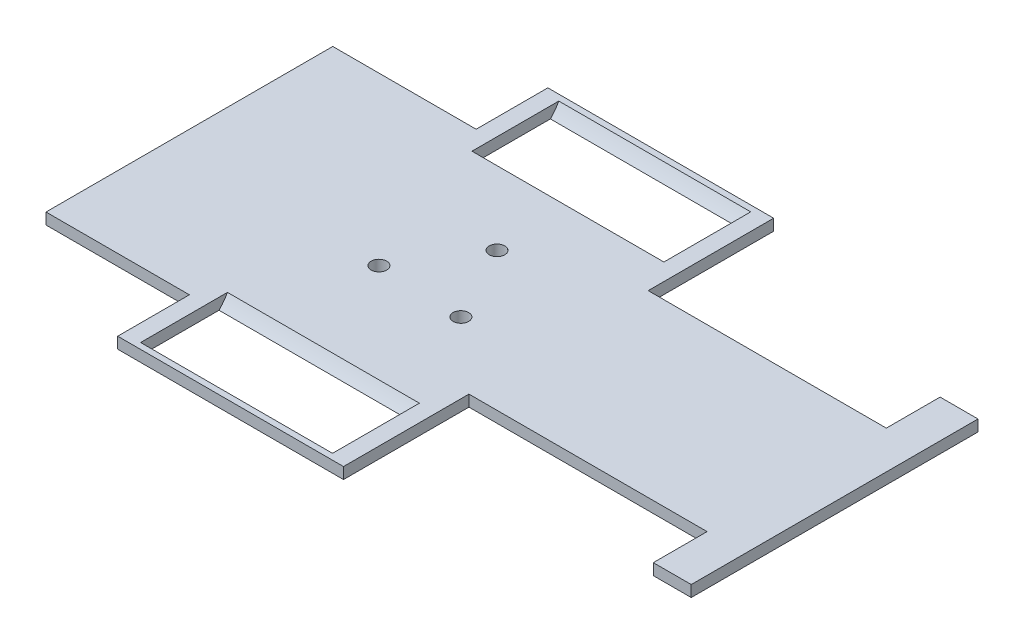
ISO-10303-21;
HEADER;
FILE_DESCRIPTION(('STEP AP214'),'2;1');
FILE_NAME('part.step','',(''),(''),'','','');
FILE_SCHEMA(('AUTOMOTIVE_DESIGN { 1 0 10303 214 1 1 1 1 }'));
ENDSEC;
DATA;
#1=APPLICATION_CONTEXT('core data for automotive mechanical design processes');
#2=APPLICATION_PROTOCOL_DEFINITION('international standard','automotive_design',2000,#1);
#3=PRODUCT_CONTEXT('',#1,'mechanical');
#4=PRODUCT('Part','Part','',(#3));
#5=PRODUCT_RELATED_PRODUCT_CATEGORY('part','',(#4));
#6=PRODUCT_DEFINITION_FORMATION('','',#4);
#7=PRODUCT_DEFINITION_CONTEXT('part definition',#1,'design');
#8=PRODUCT_DEFINITION('design','',#6,#7);
#9=PRODUCT_DEFINITION_SHAPE('','',#8);
#10=(LENGTH_UNIT() NAMED_UNIT(*) SI_UNIT(.MILLI.,.METRE.));
#11=(NAMED_UNIT(*) PLANE_ANGLE_UNIT() SI_UNIT($,.RADIAN.));
#12=(NAMED_UNIT(*) SI_UNIT($,.STERADIAN.) SOLID_ANGLE_UNIT());
#13=UNCERTAINTY_MEASURE_WITH_UNIT(LENGTH_MEASURE(1.E-05),#10,'distance_accuracy_value','');
#14=(GEOMETRIC_REPRESENTATION_CONTEXT(3) GLOBAL_UNCERTAINTY_ASSIGNED_CONTEXT((#13)) GLOBAL_UNIT_ASSIGNED_CONTEXT((#10,
#11,#12)) REPRESENTATION_CONTEXT('',''));
#15=CARTESIAN_POINT('',(0.,0.,0.));
#16=DIRECTION('',(0.,0.,1.));
#17=DIRECTION('',(1.,0.,0.));
#18=AXIS2_PLACEMENT_3D('',#15,#16,#17);
#19=CARTESIAN_POINT('',(0.,0.,0.));
#20=DIRECTION('',(0.,1.,0.));
#21=DIRECTION('',(0.,0.,1.));
#22=AXIS2_PLACEMENT_3D('',#19,#20,#21);
#23=PLANE('',#22);
#24=CARTESIAN_POINT('',(-22.6436125747901,0.,-17.3415028356434));
#25=DIRECTION('',(0.,1.,0.));
#26=DIRECTION('',(0.,0.,1.));
#27=AXIS2_PLACEMENT_3D('',#24,#25,#26);
#28=CIRCLE('',#27,2.75000000000001);
#29=CARTESIAN_POINT('',(-22.6436125747901,0.,-14.5915028356434));
#30=VERTEX_POINT('',#29);
#31=EDGE_CURVE('E96',#30,#30,#28,.T.);
#32=ORIENTED_EDGE('',*,*,#31,.T.);
#33=EDGE_LOOP('',(#32));
#34=FACE_BOUND('',#33,.T.);
#35=CARTESIAN_POINT('',(-38.8772227534926,0.,8.25576070103032));
#36=DIRECTION('',(0.,1.,0.));
#37=DIRECTION('',(0.,0.,1.));
#38=AXIS2_PLACEMENT_3D('',#35,#36,#37);
#39=CIRCLE('',#38,2.74999999999999);
#40=CARTESIAN_POINT('',(-38.8772227534926,0.,11.0057607010303));
#41=VERTEX_POINT('',#40);
#42=EDGE_CURVE('E363',#41,#41,#39,.T.);
#43=ORIENTED_EDGE('',*,*,#42,.T.);
#44=EDGE_LOOP('',(#43));
#45=FACE_BOUND('',#44,.T.);
#46=CARTESIAN_POINT('',(-8.59253717401681,0.,9.51584774258353));
#47=DIRECTION('',(0.,1.,0.));
#48=DIRECTION('',(0.,0.,1.));
#49=AXIS2_PLACEMENT_3D('',#46,#47,#48);
#50=CIRCLE('',#49,2.75);
#51=CARTESIAN_POINT('',(-8.59253717401681,0.,12.2658477425835));
#52=VERTEX_POINT('',#51);
#53=EDGE_CURVE('E359',#52,#52,#50,.T.);
#54=ORIENTED_EDGE('',*,*,#53,.T.);
#55=EDGE_LOOP('',(#54));
#56=FACE_BOUND('',#55,.T.);
#57=DIRECTION('',(0.,0.,-1.));
#58=VECTOR('',#57,1.);
#59=CARTESIAN_POINT('',(-57.5,0.,0.));
#60=LINE('',#59,#58);
#61=CARTESIAN_POINT('',(-57.5,0.,-46.2958466901622));
#62=VERTEX_POINT('',#61);
#63=CARTESIAN_POINT('',(-57.5,0.,-71.1041533098378));
#64=VERTEX_POINT('',#63);
#65=EDGE_CURVE('E102',#62,#64,#60,.T.);
#66=ORIENTED_EDGE('',*,*,#65,.F.);
#67=DIRECTION('',(1.,0.,0.));
#68=VECTOR('',#67,1.);
#69=CARTESIAN_POINT('',(-57.5,0.,-46.2958466901622));
#70=LINE('',#69,#68);
#71=CARTESIAN_POINT('',(10.5,0.,-46.2958466901622));
#72=VERTEX_POINT('',#71);
#73=EDGE_CURVE('E85',#62,#72,#70,.T.);
#74=ORIENTED_EDGE('',*,*,#73,.T.);
#75=DIRECTION('',(0.,0.,-1.));
#76=VECTOR('',#75,1.);
#77=CARTESIAN_POINT('',(10.5,0.,0.));
#78=LINE('',#77,#76);
#79=CARTESIAN_POINT('',(10.5,0.,-71.1041533098378));
#80=VERTEX_POINT('',#79);
#81=EDGE_CURVE('E95',#72,#80,#78,.T.);
#82=ORIENTED_EDGE('',*,*,#81,.T.);
#83=DIRECTION('',(1.,0.,0.));
#84=VECTOR('',#83,1.);
#85=CARTESIAN_POINT('',(-57.5,0.,-71.1041533098378));
#86=LINE('',#85,#84);
#87=EDGE_CURVE('E112',#80,#64,#86,.F.);
#88=ORIENTED_EDGE('',*,*,#87,.T.);
#89=EDGE_LOOP('',(#66,#74,#82,#88));
#90=FACE_BOUND('',#89,.T.);
#91=DIRECTION('',(0.,0.,1.));
#92=VECTOR('',#91,1.);
#93=CARTESIAN_POINT('',(16.5,0.,0.));
#94=LINE('',#93,#92);
#95=CARTESIAN_POINT('',(16.5,0.,-76.2));
#96=VERTEX_POINT('',#95);
#97=CARTESIAN_POINT('',(16.5,0.,-31.75));
#98=VERTEX_POINT('',#97);
#99=EDGE_CURVE('E297',#96,#98,#94,.T.);
#100=ORIENTED_EDGE('',*,*,#99,.T.);
#101=DIRECTION('',(1.,0.,0.));
#102=VECTOR('',#101,1.);
#103=CARTESIAN_POINT('',(0.,0.,-31.75));
#104=LINE('',#103,#102);
#105=CARTESIAN_POINT('',(100.867964721535,0.,-31.75));
#106=VERTEX_POINT('',#105);
#107=EDGE_CURVE('E293',#98,#106,#104,.T.);
#108=ORIENTED_EDGE('',*,*,#107,.T.);
#109=DIRECTION('',(0.,0.,-1.));
#110=VECTOR('',#109,1.);
#111=CARTESIAN_POINT('',(100.867964721535,0.,0.));
#112=LINE('',#111,#110);
#113=CARTESIAN_POINT('',(100.867964721535,0.,-50.8));
#114=VERTEX_POINT('',#113);
#115=EDGE_CURVE('E289',#106,#114,#112,.T.);
#116=ORIENTED_EDGE('',*,*,#115,.T.);
#117=DIRECTION('',(1.,0.,0.));
#118=VECTOR('',#117,1.);
#119=CARTESIAN_POINT('',(0.,0.,-50.8));
#120=LINE('',#119,#118);
#121=CARTESIAN_POINT('',(114.3,0.,-50.8));
#122=VERTEX_POINT('',#121);
#123=EDGE_CURVE('E285',#114,#122,#120,.T.);
#124=ORIENTED_EDGE('',*,*,#123,.T.);
#125=DIRECTION('',(0.,0.,1.));
#126=VECTOR('',#125,1.);
#127=CARTESIAN_POINT('',(114.3,0.,0.));
#128=LINE('',#127,#126);
#129=CARTESIAN_POINT('',(114.3,0.,50.8));
#130=VERTEX_POINT('',#129);
#131=EDGE_CURVE('E205',#122,#130,#128,.T.);
#132=ORIENTED_EDGE('',*,*,#131,.T.);
#133=DIRECTION('',(1.,0.,0.));
#134=VECTOR('',#133,1.);
#135=CARTESIAN_POINT('',(0.,0.,50.8));
#136=LINE('',#135,#134);
#137=CARTESIAN_POINT('',(100.867964721535,0.,50.8));
#138=VERTEX_POINT('',#137);
#139=EDGE_CURVE('E318',#138,#130,#136,.T.);
#140=ORIENTED_EDGE('',*,*,#139,.F.);
#141=DIRECTION('',(0.,0.,1.));
#142=VECTOR('',#141,1.);
#143=CARTESIAN_POINT('',(100.867964721535,0.,0.));
#144=LINE('',#143,#142);
#145=CARTESIAN_POINT('',(100.867964721535,0.,31.75));
#146=VERTEX_POINT('',#145);
#147=EDGE_CURVE('E313',#146,#138,#144,.T.);
#148=ORIENTED_EDGE('',*,*,#147,.F.);
#149=DIRECTION('',(1.,0.,0.));
#150=VECTOR('',#149,1.);
#151=CARTESIAN_POINT('',(0.,0.,31.75));
#152=LINE('',#151,#150);
#153=CARTESIAN_POINT('',(16.5,0.,31.75));
#154=VERTEX_POINT('',#153);
#155=EDGE_CURVE('E122',#154,#146,#152,.T.);
#156=ORIENTED_EDGE('',*,*,#155,.F.);
#157=DIRECTION('',(0.,0.,-1.));
#158=VECTOR('',#157,1.);
#159=CARTESIAN_POINT('',(16.5,0.,0.));
#160=LINE('',#159,#158);
#161=CARTESIAN_POINT('',(16.5,0.,76.2));
#162=VERTEX_POINT('',#161);
#163=EDGE_CURVE('E304',#162,#154,#160,.T.);
#164=ORIENTED_EDGE('',*,*,#163,.F.);
#165=DIRECTION('',(1.,0.,0.));
#166=VECTOR('',#165,1.);
#167=CARTESIAN_POINT('',(0.,0.,76.2));
#168=LINE('',#167,#166);
#169=CARTESIAN_POINT('',(-63.5,0.,76.2));
#170=VERTEX_POINT('',#169);
#171=EDGE_CURVE('E259',#170,#162,#168,.T.);
#172=ORIENTED_EDGE('',*,*,#171,.F.);
#173=DIRECTION('',(0.,0.,1.));
#174=VECTOR('',#173,1.);
#175=CARTESIAN_POINT('',(-63.5,0.,0.));
#176=LINE('',#175,#174);
#177=CARTESIAN_POINT('',(-63.5,0.,50.8));
#178=VERTEX_POINT('',#177);
#179=EDGE_CURVE('E188',#178,#170,#176,.T.);
#180=ORIENTED_EDGE('',*,*,#179,.F.);
#181=DIRECTION('',(1.,0.,0.));
#182=VECTOR('',#181,1.);
#183=CARTESIAN_POINT('',(0.,0.,50.8));
#184=LINE('',#183,#182);
#185=CARTESIAN_POINT('',(-114.3,0.,50.8));
#186=VERTEX_POINT('',#185);
#187=EDGE_CURVE('E182',#186,#178,#184,.T.);
#188=ORIENTED_EDGE('',*,*,#187,.F.);
#189=DIRECTION('',(0.,0.,1.));
#190=VECTOR('',#189,1.);
#191=CARTESIAN_POINT('',(-114.3,0.,0.));
#192=LINE('',#191,#190);
#193=CARTESIAN_POINT('',(-114.3,0.,-50.8));
#194=VERTEX_POINT('',#193);
#195=EDGE_CURVE('E183',#194,#186,#192,.T.);
#196=ORIENTED_EDGE('',*,*,#195,.F.);
#197=DIRECTION('',(1.,0.,0.));
#198=VECTOR('',#197,1.);
#199=CARTESIAN_POINT('',(0.,0.,-50.8));
#200=LINE('',#199,#198);
#201=CARTESIAN_POINT('',(-63.5,0.,-50.8));
#202=VERTEX_POINT('',#201);
#203=EDGE_CURVE('E201',#194,#202,#200,.T.);
#204=ORIENTED_EDGE('',*,*,#203,.T.);
#205=DIRECTION('',(0.,0.,-1.));
#206=VECTOR('',#205,1.);
#207=CARTESIAN_POINT('',(-63.5,0.,0.));
#208=LINE('',#207,#206);
#209=CARTESIAN_POINT('',(-63.5,0.,-76.2));
#210=VERTEX_POINT('',#209);
#211=EDGE_CURVE('E175',#202,#210,#208,.T.);
#212=ORIENTED_EDGE('',*,*,#211,.T.);
#213=DIRECTION('',(1.,0.,0.));
#214=VECTOR('',#213,1.);
#215=CARTESIAN_POINT('',(0.,0.,-76.2));
#216=LINE('',#215,#214);
#217=EDGE_CURVE('E172',#210,#96,#216,.T.);
#218=ORIENTED_EDGE('',*,*,#217,.T.);
#219=EDGE_LOOP('',(#100,#108,#116,#124,#132,#140,#148,#156,#164,#172,#180,#188,#196,#204,#212,#218));
#220=FACE_BOUND('',#219,.T.);
#221=DIRECTION('',(0.,0.,-1.));
#222=VECTOR('',#221,1.);
#223=CARTESIAN_POINT('',(-57.5,0.,0.));
#224=LINE('',#223,#222);
#225=CARTESIAN_POINT('',(-57.5,0.,71.1041533098378));
#226=VERTEX_POINT('',#225);
#227=CARTESIAN_POINT('',(-57.5,0.,46.2958466901622));
#228=VERTEX_POINT('',#227);
#229=EDGE_CURVE('E140',#226,#228,#224,.T.);
#230=ORIENTED_EDGE('',*,*,#229,.F.);
#231=DIRECTION('',(1.,0.,0.));
#232=VECTOR('',#231,1.);
#233=CARTESIAN_POINT('',(-57.5,0.,71.1041533098378));
#234=LINE('',#233,#232);
#235=CARTESIAN_POINT('',(10.5,0.,71.1041533098378));
#236=VERTEX_POINT('',#235);
#237=EDGE_CURVE('E166',#226,#236,#234,.T.);
#238=ORIENTED_EDGE('',*,*,#237,.T.);
#239=DIRECTION('',(0.,0.,-1.));
#240=VECTOR('',#239,1.);
#241=CARTESIAN_POINT('',(10.5,0.,0.));
#242=LINE('',#241,#240);
#243=CARTESIAN_POINT('',(10.5,0.,46.2958466901622));
#244=VERTEX_POINT('',#243);
#245=EDGE_CURVE('E163',#236,#244,#242,.T.);
#246=ORIENTED_EDGE('',*,*,#245,.T.);
#247=DIRECTION('',(1.,0.,0.));
#248=VECTOR('',#247,1.);
#249=CARTESIAN_POINT('',(-57.5,0.,46.2958466901622));
#250=LINE('',#249,#248);
#251=EDGE_CURVE('E157',#244,#228,#250,.F.);
#252=ORIENTED_EDGE('',*,*,#251,.T.);
#253=EDGE_LOOP('',(#230,#238,#246,#252));
#254=FACE_BOUND('',#253,.T.);
#255=ADVANCED_FACE('F45',(#34,#45,#56,#90,#220,#254),#23,.F.);
#256=CARTESIAN_POINT('',(0.,4.,76.2));
#257=DIRECTION('',(0.,0.,-1.));
#258=DIRECTION('',(-1.,0.,0.));
#259=AXIS2_PLACEMENT_3D('',#256,#257,#258);
#260=PLANE('',#259);
#261=DIRECTION('',(1.,0.,0.));
#262=VECTOR('',#261,1.);
#263=CARTESIAN_POINT('',(0.,4.,76.2));
#264=LINE('',#263,#262);
#265=CARTESIAN_POINT('',(-63.5,4.,76.2));
#266=VERTEX_POINT('',#265);
#267=CARTESIAN_POINT('',(16.5,4.,76.2));
#268=VERTEX_POINT('',#267);
#269=EDGE_CURVE('E263',#266,#268,#264,.T.);
#270=ORIENTED_EDGE('',*,*,#269,.F.);
#271=DIRECTION('',(0.,-1.,0.));
#272=VECTOR('',#271,1.);
#273=CARTESIAN_POINT('',(-63.5,4.,76.2));
#274=LINE('',#273,#272);
#275=EDGE_CURVE('E171',#266,#170,#274,.T.);
#276=ORIENTED_EDGE('',*,*,#275,.T.);
#277=ORIENTED_EDGE('',*,*,#171,.T.);
#278=DIRECTION('',(0.,-1.,0.));
#279=VECTOR('',#278,1.);
#280=CARTESIAN_POINT('',(16.5,4.,76.2));
#281=LINE('',#280,#279);
#282=EDGE_CURVE('E308',#268,#162,#281,.T.);
#283=ORIENTED_EDGE('',*,*,#282,.F.);
#284=EDGE_LOOP('',(#270,#276,#277,#283));
#285=FACE_BOUND('',#284,.T.);
#286=ADVANCED_FACE('F530',(#285),#260,.F.);
#287=CARTESIAN_POINT('',(0.,4.,-76.2));
#288=DIRECTION('',(0.,0.,-1.));
#289=DIRECTION('',(-1.,0.,0.));
#290=AXIS2_PLACEMENT_3D('',#287,#288,#289);
#291=PLANE('',#290);
#292=DIRECTION('',(0.,-1.,0.));
#293=VECTOR('',#292,1.);
#294=CARTESIAN_POINT('',(-63.5,4.,-76.2));
#295=LINE('',#294,#293);
#296=CARTESIAN_POINT('',(-63.5,4.,-76.2));
#297=VERTEX_POINT('',#296);
#298=EDGE_CURVE('E340',#297,#210,#295,.T.);
#299=ORIENTED_EDGE('',*,*,#298,.F.);
#300=DIRECTION('',(1.,0.,0.));
#301=VECTOR('',#300,1.);
#302=CARTESIAN_POINT('',(0.,4.,-76.2));
#303=LINE('',#302,#301);
#304=CARTESIAN_POINT('',(16.5,4.,-76.2));
#305=VERTEX_POINT('',#304);
#306=EDGE_CURVE('E255',#297,#305,#303,.T.);
#307=ORIENTED_EDGE('',*,*,#306,.T.);
#308=DIRECTION('',(0.,-1.,0.));
#309=VECTOR('',#308,1.);
#310=CARTESIAN_POINT('',(16.5,4.,-76.2));
#311=LINE('',#310,#309);
#312=EDGE_CURVE('E228',#305,#96,#311,.T.);
#313=ORIENTED_EDGE('',*,*,#312,.T.);
#314=ORIENTED_EDGE('',*,*,#217,.F.);
#315=EDGE_LOOP('',(#299,#307,#313,#314));
#316=FACE_BOUND('',#315,.T.);
#317=ADVANCED_FACE('F536',(#316),#291,.T.);
#318=CARTESIAN_POINT('',(-63.5,4.,0.));
#319=DIRECTION('',(1.,0.,0.));
#320=DIRECTION('',(0.,0.,-1.));
#321=AXIS2_PLACEMENT_3D('',#318,#319,#320);
#322=PLANE('',#321);
#323=DIRECTION('',(0.,-1.,0.));
#324=VECTOR('',#323,1.);
#325=CARTESIAN_POINT('',(-63.5,4.,50.8));
#326=LINE('',#325,#324);
#327=CARTESIAN_POINT('',(-63.5,4.,50.8));
#328=VERTEX_POINT('',#327);
#329=EDGE_CURVE('E193',#328,#178,#326,.T.);
#330=ORIENTED_EDGE('',*,*,#329,.T.);
#331=ORIENTED_EDGE('',*,*,#179,.T.);
#332=ORIENTED_EDGE('',*,*,#275,.F.);
#333=DIRECTION('',(0.,0.,-1.));
#334=VECTOR('',#333,1.);
#335=CARTESIAN_POINT('',(-63.5,4.,0.));
#336=LINE('',#335,#334);
#337=EDGE_CURVE('E192',#266,#328,#336,.T.);
#338=ORIENTED_EDGE('',*,*,#337,.T.);
#339=EDGE_LOOP('',(#330,#331,#332,#338));
#340=FACE_BOUND('',#339,.T.);
#341=ADVANCED_FACE('F502',(#340),#322,.F.);
#342=CARTESIAN_POINT('',(0.,4.,0.));
#343=DIRECTION('',(0.,1.,0.));
#344=DIRECTION('',(0.,0.,1.));
#345=AXIS2_PLACEMENT_3D('',#342,#343,#344);
#346=PLANE('',#345);
#347=ORIENTED_EDGE('',*,*,#337,.F.);
#348=ORIENTED_EDGE('',*,*,#269,.T.);
#349=DIRECTION('',(0.,0.,-1.));
#350=VECTOR('',#349,1.);
#351=CARTESIAN_POINT('',(16.5,4.,0.));
#352=LINE('',#351,#350);
#353=CARTESIAN_POINT('',(16.5,4.,31.75));
#354=VERTEX_POINT('',#353);
#355=EDGE_CURVE('E267',#268,#354,#352,.T.);
#356=ORIENTED_EDGE('',*,*,#355,.T.);
#357=DIRECTION('',(1.,0.,0.));
#358=VECTOR('',#357,1.);
#359=CARTESIAN_POINT('',(0.,4.,31.75));
#360=LINE('',#359,#358);
#361=CARTESIAN_POINT('',(100.867964721535,4.,31.75));
#362=VERTEX_POINT('',#361);
#363=EDGE_CURVE('E271',#354,#362,#360,.T.);
#364=ORIENTED_EDGE('',*,*,#363,.T.);
#365=DIRECTION('',(0.,0.,1.));
#366=VECTOR('',#365,1.);
#367=CARTESIAN_POINT('',(100.867964721535,4.,0.));
#368=LINE('',#367,#366);
#369=CARTESIAN_POINT('',(100.867964721535,4.,50.8));
#370=VERTEX_POINT('',#369);
#371=EDGE_CURVE('E275',#362,#370,#368,.T.);
#372=ORIENTED_EDGE('',*,*,#371,.T.);
#373=DIRECTION('',(1.,0.,0.));
#374=VECTOR('',#373,1.);
#375=CARTESIAN_POINT('',(0.,4.,50.8));
#376=LINE('',#375,#374);
#377=CARTESIAN_POINT('',(114.3,4.,50.8));
#378=VERTEX_POINT('',#377);
#379=EDGE_CURVE('E216',#370,#378,#376,.T.);
#380=ORIENTED_EDGE('',*,*,#379,.T.);
#381=DIRECTION('',(0.,0.,1.));
#382=VECTOR('',#381,1.);
#383=CARTESIAN_POINT('',(114.3,4.,0.));
#384=LINE('',#383,#382);
#385=CARTESIAN_POINT('',(114.3,4.,-50.8));
#386=VERTEX_POINT('',#385);
#387=EDGE_CURVE('E229',#386,#378,#384,.T.);
#388=ORIENTED_EDGE('',*,*,#387,.F.);
#389=DIRECTION('',(1.,0.,0.));
#390=VECTOR('',#389,1.);
#391=CARTESIAN_POINT('',(0.,4.,-50.8));
#392=LINE('',#391,#390);
#393=CARTESIAN_POINT('',(100.867964721535,4.,-50.8));
#394=VERTEX_POINT('',#393);
#395=EDGE_CURVE('E235',#394,#386,#392,.T.);
#396=ORIENTED_EDGE('',*,*,#395,.F.);
#397=DIRECTION('',(0.,0.,-1.));
#398=VECTOR('',#397,1.);
#399=CARTESIAN_POINT('',(100.867964721535,4.,0.));
#400=LINE('',#399,#398);
#401=CARTESIAN_POINT('',(100.867964721535,4.,-31.75));
#402=VERTEX_POINT('',#401);
#403=EDGE_CURVE('E240',#402,#394,#400,.T.);
#404=ORIENTED_EDGE('',*,*,#403,.F.);
#405=DIRECTION('',(1.,0.,0.));
#406=VECTOR('',#405,1.);
#407=CARTESIAN_POINT('',(0.,4.,-31.75));
#408=LINE('',#407,#406);
#409=CARTESIAN_POINT('',(16.5,4.,-31.75));
#410=VERTEX_POINT('',#409);
#411=EDGE_CURVE('E245',#410,#402,#408,.T.);
#412=ORIENTED_EDGE('',*,*,#411,.F.);
#413=DIRECTION('',(0.,0.,1.));
#414=VECTOR('',#413,1.);
#415=CARTESIAN_POINT('',(16.5,4.,0.));
#416=LINE('',#415,#414);
#417=EDGE_CURVE('E250',#305,#410,#416,.T.);
#418=ORIENTED_EDGE('',*,*,#417,.F.);
#419=ORIENTED_EDGE('',*,*,#306,.F.);
#420=CARTESIAN_POINT('',(-63.5,4.,-50.8));
#421=VERTEX_POINT('',#420);
#422=EDGE_CURVE('E221',#421,#297,#336,.T.);
#423=ORIENTED_EDGE('',*,*,#422,.F.);
#424=DIRECTION('',(1.,0.,0.));
#425=VECTOR('',#424,1.);
#426=CARTESIAN_POINT('',(0.,4.,-50.8));
#427=LINE('',#426,#425);
#428=CARTESIAN_POINT('',(-114.3,4.,-50.8));
#429=VERTEX_POINT('',#428);
#430=EDGE_CURVE('E217',#429,#421,#427,.T.);
#431=ORIENTED_EDGE('',*,*,#430,.F.);
#432=DIRECTION('',(0.,0.,1.));
#433=VECTOR('',#432,1.);
#434=CARTESIAN_POINT('',(-114.3,4.,0.));
#435=LINE('',#434,#433);
#436=CARTESIAN_POINT('',(-114.3,4.,50.8));
#437=VERTEX_POINT('',#436);
#438=EDGE_CURVE('E212',#429,#437,#435,.T.);
#439=ORIENTED_EDGE('',*,*,#438,.T.);
#440=DIRECTION('',(1.,0.,0.));
#441=VECTOR('',#440,1.);
#442=CARTESIAN_POINT('',(0.,4.,50.8));
#443=LINE('',#442,#441);
#444=EDGE_CURVE('E161',#437,#328,#443,.T.);
#445=ORIENTED_EDGE('',*,*,#444,.T.);
#446=EDGE_LOOP('',(#347,#348,#356,#364,#372,#380,#388,#396,#404,#412,#418,#419,#423,#431,#439,#445));
#447=FACE_BOUND('',#446,.T.);
#448=DIRECTION('',(0.,0.,-1.));
#449=VECTOR('',#448,1.);
#450=CARTESIAN_POINT('',(-57.5,4.,0.));
#451=LINE('',#450,#449);
#452=CARTESIAN_POINT('',(-57.5,4.,74.0824288289595));
#453=VERTEX_POINT('',#452);
#454=CARTESIAN_POINT('',(-57.5,4.,43.3175711710404));
#455=VERTEX_POINT('',#454);
#456=EDGE_CURVE('E123',#453,#455,#451,.T.);
#457=ORIENTED_EDGE('',*,*,#456,.T.);
#458=DIRECTION('',(1.,0.,0.));
#459=VECTOR('',#458,1.);
#460=CARTESIAN_POINT('',(-57.5,4.,43.3175711710404));
#461=LINE('',#460,#459);
#462=CARTESIAN_POINT('',(10.5,4.,43.3175711710404));
#463=VERTEX_POINT('',#462);
#464=EDGE_CURVE('E390',#463,#455,#461,.F.);
#465=ORIENTED_EDGE('',*,*,#464,.F.);
#466=DIRECTION('',(0.,0.,-1.));
#467=VECTOR('',#466,1.);
#468=CARTESIAN_POINT('',(10.5,4.,0.));
#469=LINE('',#468,#467);
#470=CARTESIAN_POINT('',(10.5,4.,74.0824288289595));
#471=VERTEX_POINT('',#470);
#472=EDGE_CURVE('E11',#471,#463,#469,.T.);
#473=ORIENTED_EDGE('',*,*,#472,.F.);
#474=DIRECTION('',(1.,0.,0.));
#475=VECTOR('',#474,1.);
#476=CARTESIAN_POINT('',(-57.5,4.,74.0824288289595));
#477=LINE('',#476,#475);
#478=EDGE_CURVE('E65',#453,#471,#477,.T.);
#479=ORIENTED_EDGE('',*,*,#478,.F.);
#480=EDGE_LOOP('',(#457,#465,#473,#479));
#481=FACE_BOUND('',#480,.T.);
#482=DIRECTION('',(1.,0.,0.));
#483=VECTOR('',#482,1.);
#484=CARTESIAN_POINT('',(-57.5,4.,-43.3175711710404));
#485=LINE('',#484,#483);
#486=CARTESIAN_POINT('',(-57.5,4.,-43.3175711710404));
#487=VERTEX_POINT('',#486);
#488=CARTESIAN_POINT('',(10.5,4.,-43.3175711710405));
#489=VERTEX_POINT('',#488);
#490=EDGE_CURVE('E385',#487,#489,#485,.T.);
#491=ORIENTED_EDGE('',*,*,#490,.F.);
#492=DIRECTION('',(0.,0.,-1.));
#493=VECTOR('',#492,1.);
#494=CARTESIAN_POINT('',(-57.5,4.,0.));
#495=LINE('',#494,#493);
#496=CARTESIAN_POINT('',(-57.5,4.,-74.0824288289596));
#497=VERTEX_POINT('',#496);
#498=EDGE_CURVE('E105',#487,#497,#495,.T.);
#499=ORIENTED_EDGE('',*,*,#498,.T.);
#500=DIRECTION('',(1.,0.,0.));
#501=VECTOR('',#500,1.);
#502=CARTESIAN_POINT('',(-57.5,4.,-74.0824288289596));
#503=LINE('',#502,#501);
#504=CARTESIAN_POINT('',(10.5,4.,-74.0824288289596));
#505=VERTEX_POINT('',#504);
#506=EDGE_CURVE('E379',#505,#497,#503,.F.);
#507=ORIENTED_EDGE('',*,*,#506,.F.);
#508=DIRECTION('',(0.,0.,-1.));
#509=VECTOR('',#508,1.);
#510=CARTESIAN_POINT('',(10.5,4.,0.));
#511=LINE('',#510,#509);
#512=EDGE_CURVE('E107',#489,#505,#511,.T.);
#513=ORIENTED_EDGE('',*,*,#512,.F.);
#514=EDGE_LOOP('',(#491,#499,#507,#513));
#515=FACE_BOUND('',#514,.T.);
#516=CARTESIAN_POINT('',(-38.8772227534926,4.,8.25576070103032));
#517=DIRECTION('',(0.,1.,0.));
#518=DIRECTION('',(0.,0.,1.));
#519=AXIS2_PLACEMENT_3D('',#516,#517,#518);
#520=CIRCLE('',#519,2.74999999999999);
#521=CARTESIAN_POINT('',(-38.8772227534926,4.,11.0057607010303));
#522=VERTEX_POINT('',#521);
#523=EDGE_CURVE('E368',#522,#522,#520,.T.);
#524=ORIENTED_EDGE('',*,*,#523,.F.);
#525=EDGE_LOOP('',(#524));
#526=FACE_BOUND('',#525,.T.);
#527=CARTESIAN_POINT('',(-22.6436125747901,4.,-17.3415028356434));
#528=DIRECTION('',(0.,1.,0.));
#529=DIRECTION('',(0.,0.,1.));
#530=AXIS2_PLACEMENT_3D('',#527,#528,#529);
#531=CIRCLE('',#530,2.75000000000001);
#532=CARTESIAN_POINT('',(-22.6436125747901,4.,-14.5915028356434));
#533=VERTEX_POINT('',#532);
#534=EDGE_CURVE('E375',#533,#533,#531,.T.);
#535=ORIENTED_EDGE('',*,*,#534,.F.);
#536=EDGE_LOOP('',(#535));
#537=FACE_BOUND('',#536,.T.);
#538=CARTESIAN_POINT('',(-8.59253717401681,4.,9.51584774258353));
#539=DIRECTION('',(0.,1.,0.));
#540=DIRECTION('',(0.,0.,1.));
#541=AXIS2_PLACEMENT_3D('',#538,#539,#540);
#542=CIRCLE('',#541,2.75);
#543=CARTESIAN_POINT('',(-8.59253717401681,4.,12.2658477425835));
#544=VERTEX_POINT('',#543);
#545=EDGE_CURVE('E364',#544,#544,#542,.T.);
#546=ORIENTED_EDGE('',*,*,#545,.F.);
#547=EDGE_LOOP('',(#546));
#548=FACE_BOUND('',#547,.T.);
#549=ADVANCED_FACE('F402',(#447,#481,#515,#526,#537,#548),#346,.T.);
#550=CARTESIAN_POINT('',(0.,4.,31.75));
#551=DIRECTION('',(0.,0.,-1.));
#552=DIRECTION('',(-1.,0.,0.));
#553=AXIS2_PLACEMENT_3D('',#550,#551,#552);
#554=PLANE('',#553);
#555=ORIENTED_EDGE('',*,*,#155,.T.);
#556=DIRECTION('',(0.,-1.,0.));
#557=VECTOR('',#556,1.);
#558=CARTESIAN_POINT('',(100.867964721535,4.,31.75));
#559=LINE('',#558,#557);
#560=EDGE_CURVE('E317',#362,#146,#559,.T.);
#561=ORIENTED_EDGE('',*,*,#560,.F.);
#562=ORIENTED_EDGE('',*,*,#363,.F.);
#563=DIRECTION('',(0.,-1.,0.));
#564=VECTOR('',#563,1.);
#565=CARTESIAN_POINT('',(16.5,4.,31.75));
#566=LINE('',#565,#564);
#567=EDGE_CURVE('E309',#354,#154,#566,.T.);
#568=ORIENTED_EDGE('',*,*,#567,.T.);
#569=EDGE_LOOP('',(#555,#561,#562,#568));
#570=FACE_BOUND('',#569,.T.);
#571=ADVANCED_FACE('F501',(#570),#554,.F.);
#572=CARTESIAN_POINT('',(16.5,4.,0.));
#573=DIRECTION('',(-1.,0.,0.));
#574=DIRECTION('',(0.,0.,1.));
#575=AXIS2_PLACEMENT_3D('',#572,#573,#574);
#576=PLANE('',#575);
#577=ORIENTED_EDGE('',*,*,#163,.T.);
#578=ORIENTED_EDGE('',*,*,#567,.F.);
#579=ORIENTED_EDGE('',*,*,#355,.F.);
#580=ORIENTED_EDGE('',*,*,#282,.T.);
#581=EDGE_LOOP('',(#577,#578,#579,#580));
#582=FACE_BOUND('',#581,.T.);
#583=ADVANCED_FACE('F622',(#582),#576,.F.);
#584=CARTESIAN_POINT('',(100.867964721535,4.,0.));
#585=DIRECTION('',(1.,0.,0.));
#586=DIRECTION('',(0.,0.,-1.));
#587=AXIS2_PLACEMENT_3D('',#584,#585,#586);
#588=PLANE('',#587);
#589=ORIENTED_EDGE('',*,*,#147,.T.);
#590=DIRECTION('',(0.,-1.,0.));
#591=VECTOR('',#590,1.);
#592=CARTESIAN_POINT('',(100.867964721535,4.,50.8));
#593=LINE('',#592,#591);
#594=EDGE_CURVE('E234',#370,#138,#593,.T.);
#595=ORIENTED_EDGE('',*,*,#594,.F.);
#596=ORIENTED_EDGE('',*,*,#371,.F.);
#597=ORIENTED_EDGE('',*,*,#560,.T.);
#598=EDGE_LOOP('',(#589,#595,#596,#597));
#599=FACE_BOUND('',#598,.T.);
#600=ADVANCED_FACE('F613',(#599),#588,.F.);
#601=CARTESIAN_POINT('',(0.,4.,50.8));
#602=DIRECTION('',(0.,0.,-1.));
#603=DIRECTION('',(-1.,0.,0.));
#604=AXIS2_PLACEMENT_3D('',#601,#602,#603);
#605=PLANE('',#604);
#606=ORIENTED_EDGE('',*,*,#139,.T.);
#607=DIRECTION('',(0.,-1.,0.));
#608=VECTOR('',#607,1.);
#609=CARTESIAN_POINT('',(114.3,4.,50.8));
#610=LINE('',#609,#608);
#611=EDGE_CURVE('E233',#378,#130,#610,.T.);
#612=ORIENTED_EDGE('',*,*,#611,.F.);
#613=ORIENTED_EDGE('',*,*,#379,.F.);
#614=ORIENTED_EDGE('',*,*,#594,.T.);
#615=EDGE_LOOP('',(#606,#612,#613,#614));
#616=FACE_BOUND('',#615,.T.);
#617=ADVANCED_FACE('F541',(#616),#605,.F.);
#618=CARTESIAN_POINT('',(114.3,4.,0.));
#619=DIRECTION('',(1.,0.,0.));
#620=DIRECTION('',(0.,0.,-1.));
#621=AXIS2_PLACEMENT_3D('',#618,#619,#620);
#622=PLANE('',#621);
#623=ORIENTED_EDGE('',*,*,#131,.F.);
#624=DIRECTION('',(0.,-1.,0.));
#625=VECTOR('',#624,1.);
#626=CARTESIAN_POINT('',(114.3,4.,-50.8));
#627=LINE('',#626,#625);
#628=EDGE_CURVE('E239',#386,#122,#627,.T.);
#629=ORIENTED_EDGE('',*,*,#628,.F.);
#630=ORIENTED_EDGE('',*,*,#387,.T.);
#631=ORIENTED_EDGE('',*,*,#611,.T.);
#632=EDGE_LOOP('',(#623,#629,#630,#631));
#633=FACE_BOUND('',#632,.T.);
#634=ADVANCED_FACE('F605',(#633),#622,.T.);
#635=CARTESIAN_POINT('',(0.,4.,-50.8));
#636=DIRECTION('',(0.,0.,-1.));
#637=DIRECTION('',(-1.,0.,0.));
#638=AXIS2_PLACEMENT_3D('',#635,#636,#637);
#639=PLANE('',#638);
#640=ORIENTED_EDGE('',*,*,#123,.F.);
#641=DIRECTION('',(0.,-1.,0.));
#642=VECTOR('',#641,1.);
#643=CARTESIAN_POINT('',(100.867964721535,4.,-50.8));
#644=LINE('',#643,#642);
#645=EDGE_CURVE('E244',#394,#114,#644,.T.);
#646=ORIENTED_EDGE('',*,*,#645,.F.);
#647=ORIENTED_EDGE('',*,*,#395,.T.);
#648=ORIENTED_EDGE('',*,*,#628,.T.);
#649=EDGE_LOOP('',(#640,#646,#647,#648));
#650=FACE_BOUND('',#649,.T.);
#651=ADVANCED_FACE('F600',(#650),#639,.T.);
#652=CARTESIAN_POINT('',(100.867964721535,4.,0.));
#653=DIRECTION('',(-1.,0.,0.));
#654=DIRECTION('',(0.,0.,1.));
#655=AXIS2_PLACEMENT_3D('',#652,#653,#654);
#656=PLANE('',#655);
#657=ORIENTED_EDGE('',*,*,#115,.F.);
#658=DIRECTION('',(0.,-1.,0.));
#659=VECTOR('',#658,1.);
#660=CARTESIAN_POINT('',(100.867964721535,4.,-31.75));
#661=LINE('',#660,#659);
#662=EDGE_CURVE('E249',#402,#106,#661,.T.);
#663=ORIENTED_EDGE('',*,*,#662,.F.);
#664=ORIENTED_EDGE('',*,*,#403,.T.);
#665=ORIENTED_EDGE('',*,*,#645,.T.);
#666=EDGE_LOOP('',(#657,#663,#664,#665));
#667=FACE_BOUND('',#666,.T.);
#668=ADVANCED_FACE('F596',(#667),#656,.T.);
#669=CARTESIAN_POINT('',(0.,4.,-31.75));
#670=DIRECTION('',(0.,0.,-1.));
#671=DIRECTION('',(-1.,0.,0.));
#672=AXIS2_PLACEMENT_3D('',#669,#670,#671);
#673=PLANE('',#672);
#674=ORIENTED_EDGE('',*,*,#107,.F.);
#675=DIRECTION('',(0.,-1.,0.));
#676=VECTOR('',#675,1.);
#677=CARTESIAN_POINT('',(16.5,4.,-31.75));
#678=LINE('',#677,#676);
#679=EDGE_CURVE('E254',#410,#98,#678,.T.);
#680=ORIENTED_EDGE('',*,*,#679,.F.);
#681=ORIENTED_EDGE('',*,*,#411,.T.);
#682=ORIENTED_EDGE('',*,*,#662,.T.);
#683=EDGE_LOOP('',(#674,#680,#681,#682));
#684=FACE_BOUND('',#683,.T.);
#685=ADVANCED_FACE('F594',(#684),#673,.T.);
#686=CARTESIAN_POINT('',(16.5,4.,0.));
#687=DIRECTION('',(1.,0.,0.));
#688=DIRECTION('',(0.,0.,-1.));
#689=AXIS2_PLACEMENT_3D('',#686,#687,#688);
#690=PLANE('',#689);
#691=ORIENTED_EDGE('',*,*,#99,.F.);
#692=ORIENTED_EDGE('',*,*,#312,.F.);
#693=ORIENTED_EDGE('',*,*,#417,.T.);
#694=ORIENTED_EDGE('',*,*,#679,.T.);
#695=EDGE_LOOP('',(#691,#692,#693,#694));
#696=FACE_BOUND('',#695,.T.);
#697=ADVANCED_FACE('F590',(#696),#690,.T.);
#698=ORIENTED_EDGE('',*,*,#298,.T.);
#699=ORIENTED_EDGE('',*,*,#211,.F.);
#700=DIRECTION('',(0.,-1.,0.));
#701=VECTOR('',#700,1.);
#702=CARTESIAN_POINT('',(-63.5,4.,-50.8));
#703=LINE('',#702,#701);
#704=EDGE_CURVE('E200',#421,#202,#703,.T.);
#705=ORIENTED_EDGE('',*,*,#704,.F.);
#706=ORIENTED_EDGE('',*,*,#422,.T.);
#707=EDGE_LOOP('',(#698,#699,#705,#706));
#708=FACE_BOUND('',#707,.T.);
#709=ADVANCED_FACE('F505',(#708),#322,.F.);
#710=CARTESIAN_POINT('',(0.,4.,-50.8));
#711=DIRECTION('',(0.,0.,-1.));
#712=DIRECTION('',(-1.,0.,0.));
#713=AXIS2_PLACEMENT_3D('',#710,#711,#712);
#714=PLANE('',#713);
#715=ORIENTED_EDGE('',*,*,#203,.F.);
#716=DIRECTION('',(0.,-1.,0.));
#717=VECTOR('',#716,1.);
#718=CARTESIAN_POINT('',(-114.3,4.,-50.8));
#719=LINE('',#718,#717);
#720=EDGE_CURVE('E178',#429,#194,#719,.T.);
#721=ORIENTED_EDGE('',*,*,#720,.F.);
#722=ORIENTED_EDGE('',*,*,#430,.T.);
#723=ORIENTED_EDGE('',*,*,#704,.T.);
#724=EDGE_LOOP('',(#715,#721,#722,#723));
#725=FACE_BOUND('',#724,.T.);
#726=ADVANCED_FACE('F551',(#725),#714,.T.);
#727=CARTESIAN_POINT('',(-114.3,4.,0.));
#728=DIRECTION('',(1.,0.,0.));
#729=DIRECTION('',(0.,0.,-1.));
#730=AXIS2_PLACEMENT_3D('',#727,#728,#729);
#731=PLANE('',#730);
#732=ORIENTED_EDGE('',*,*,#195,.T.);
#733=DIRECTION('',(0.,-1.,0.));
#734=VECTOR('',#733,1.);
#735=CARTESIAN_POINT('',(-114.3,4.,50.8));
#736=LINE('',#735,#734);
#737=EDGE_CURVE('E184',#437,#186,#736,.T.);
#738=ORIENTED_EDGE('',*,*,#737,.F.);
#739=ORIENTED_EDGE('',*,*,#438,.F.);
#740=ORIENTED_EDGE('',*,*,#720,.T.);
#741=EDGE_LOOP('',(#732,#738,#739,#740));
#742=FACE_BOUND('',#741,.T.);
#743=ADVANCED_FACE('F547',(#742),#731,.F.);
#744=CARTESIAN_POINT('',(0.,4.,50.8));
#745=DIRECTION('',(0.,0.,-1.));
#746=DIRECTION('',(-1.,0.,0.));
#747=AXIS2_PLACEMENT_3D('',#744,#745,#746);
#748=PLANE('',#747);
#749=ORIENTED_EDGE('',*,*,#187,.T.);
#750=ORIENTED_EDGE('',*,*,#329,.F.);
#751=ORIENTED_EDGE('',*,*,#444,.F.);
#752=ORIENTED_EDGE('',*,*,#737,.T.);
#753=EDGE_LOOP('',(#749,#750,#751,#752));
#754=FACE_BOUND('',#753,.T.);
#755=ADVANCED_FACE('F544',(#754),#748,.F.);
#756=CARTESIAN_POINT('',(-57.5,12.3445121680057,-58.7));
#757=DIRECTION('',(1.,0.,0.));
#758=DIRECTION('',(0.,0.,-1.));
#759=AXIS2_PLACEMENT_3D('',#756,#757,#758);
#760=CYLINDRICAL_SURFACE('',#759,17.5);
#761=CARTESIAN_POINT('',(10.5,12.3445121680057,-58.7));
#762=DIRECTION('',(1.,0.,0.));
#763=DIRECTION('',(0.,0.,-1.));
#764=AXIS2_PLACEMENT_3D('',#761,#762,#763);
#765=CIRCLE('',#764,17.5);
#766=EDGE_CURVE('E117',#80,#505,#765,.T.);
#767=ORIENTED_EDGE('',*,*,#766,.T.);
#768=ORIENTED_EDGE('',*,*,#506,.T.);
#769=CARTESIAN_POINT('',(-57.5,12.3445121680057,-58.7));
#770=DIRECTION('',(1.,0.,0.));
#771=DIRECTION('',(0.,0.,-1.));
#772=AXIS2_PLACEMENT_3D('',#769,#770,#771);
#773=CIRCLE('',#772,17.5);
#774=EDGE_CURVE('E108',#64,#497,#773,.T.);
#775=ORIENTED_EDGE('',*,*,#774,.F.);
#776=ORIENTED_EDGE('',*,*,#87,.F.);
#777=EDGE_LOOP('',(#767,#768,#775,#776));
#778=FACE_BOUND('',#777,.T.);
#779=ADVANCED_FACE('F496',(#778),#760,.F.);
#780=EDGE_CURVE('E49',#487,#62,#773,.T.);
#781=ORIENTED_EDGE('',*,*,#780,.F.);
#782=ORIENTED_EDGE('',*,*,#490,.T.);
#783=EDGE_CURVE('E90',#489,#72,#765,.T.);
#784=ORIENTED_EDGE('',*,*,#783,.T.);
#785=ORIENTED_EDGE('',*,*,#73,.F.);
#786=EDGE_LOOP('',(#781,#782,#784,#785));
#787=FACE_BOUND('',#786,.T.);
#788=ADVANCED_FACE('F47',(#787),#760,.F.);
#789=CARTESIAN_POINT('',(-57.5,12.3445121680057,-58.7));
#790=DIRECTION('',(1.,0.,0.));
#791=DIRECTION('',(0.,0.,-1.));
#792=AXIS2_PLACEMENT_3D('',#789,#790,#791);
#793=PLANE('',#792);
#794=ORIENTED_EDGE('',*,*,#65,.T.);
#795=ORIENTED_EDGE('',*,*,#774,.T.);
#796=ORIENTED_EDGE('',*,*,#498,.F.);
#797=ORIENTED_EDGE('',*,*,#780,.T.);
#798=EDGE_LOOP('',(#794,#795,#796,#797));
#799=FACE_BOUND('',#798,.T.);
#800=ADVANCED_FACE('F100',(#799),#793,.T.);
#801=CARTESIAN_POINT('',(10.5,12.3445121680057,-58.7));
#802=DIRECTION('',(1.,0.,0.));
#803=DIRECTION('',(0.,0.,-1.));
#804=AXIS2_PLACEMENT_3D('',#801,#802,#803);
#805=PLANE('',#804);
#806=ORIENTED_EDGE('',*,*,#512,.T.);
#807=ORIENTED_EDGE('',*,*,#766,.F.);
#808=ORIENTED_EDGE('',*,*,#81,.F.);
#809=ORIENTED_EDGE('',*,*,#783,.F.);
#810=EDGE_LOOP('',(#806,#807,#808,#809));
#811=FACE_BOUND('',#810,.T.);
#812=ADVANCED_FACE('F491',(#811),#805,.F.);
#813=CARTESIAN_POINT('',(-57.5,12.3445121680057,58.7));
#814=DIRECTION('',(1.,0.,0.));
#815=DIRECTION('',(0.,0.,-1.));
#816=AXIS2_PLACEMENT_3D('',#813,#814,#815);
#817=CYLINDRICAL_SURFACE('',#816,17.5);
#818=CARTESIAN_POINT('',(-57.5,12.3445121680057,58.7));
#819=DIRECTION('',(1.,0.,0.));
#820=DIRECTION('',(0.,0.,-1.));
#821=AXIS2_PLACEMENT_3D('',#818,#819,#820);
#822=CIRCLE('',#821,17.5);
#823=EDGE_CURVE('E56',#453,#226,#822,.T.);
#824=ORIENTED_EDGE('',*,*,#823,.F.);
#825=ORIENTED_EDGE('',*,*,#478,.T.);
#826=CARTESIAN_POINT('',(10.5,12.3445121680057,58.7));
#827=DIRECTION('',(1.,0.,0.));
#828=DIRECTION('',(0.,0.,-1.));
#829=AXIS2_PLACEMENT_3D('',#826,#827,#828);
#830=CIRCLE('',#829,17.5);
#831=EDGE_CURVE('E127',#471,#236,#830,.T.);
#832=ORIENTED_EDGE('',*,*,#831,.T.);
#833=ORIENTED_EDGE('',*,*,#237,.F.);
#834=EDGE_LOOP('',(#824,#825,#832,#833));
#835=FACE_BOUND('',#834,.T.);
#836=ADVANCED_FACE('F559',(#835),#817,.F.);
#837=EDGE_CURVE('E135',#244,#463,#830,.T.);
#838=ORIENTED_EDGE('',*,*,#837,.T.);
#839=ORIENTED_EDGE('',*,*,#464,.T.);
#840=EDGE_CURVE('E133',#228,#455,#822,.T.);
#841=ORIENTED_EDGE('',*,*,#840,.F.);
#842=ORIENTED_EDGE('',*,*,#251,.F.);
#843=EDGE_LOOP('',(#838,#839,#841,#842));
#844=FACE_BOUND('',#843,.T.);
#845=ADVANCED_FACE('F394',(#844),#817,.F.);
#846=CARTESIAN_POINT('',(-57.5,12.3445121680057,58.7));
#847=DIRECTION('',(1.,0.,0.));
#848=DIRECTION('',(0.,0.,-1.));
#849=AXIS2_PLACEMENT_3D('',#846,#847,#848);
#850=PLANE('',#849);
#851=ORIENTED_EDGE('',*,*,#229,.T.);
#852=ORIENTED_EDGE('',*,*,#840,.T.);
#853=ORIENTED_EDGE('',*,*,#456,.F.);
#854=ORIENTED_EDGE('',*,*,#823,.T.);
#855=EDGE_LOOP('',(#851,#852,#853,#854));
#856=FACE_BOUND('',#855,.T.);
#857=ADVANCED_FACE('F400',(#856),#850,.T.);
#858=CARTESIAN_POINT('',(10.5,12.3445121680057,58.7));
#859=DIRECTION('',(1.,0.,0.));
#860=DIRECTION('',(0.,0.,-1.));
#861=AXIS2_PLACEMENT_3D('',#858,#859,#860);
#862=PLANE('',#861);
#863=ORIENTED_EDGE('',*,*,#472,.T.);
#864=ORIENTED_EDGE('',*,*,#837,.F.);
#865=ORIENTED_EDGE('',*,*,#245,.F.);
#866=ORIENTED_EDGE('',*,*,#831,.F.);
#867=EDGE_LOOP('',(#863,#864,#865,#866));
#868=FACE_BOUND('',#867,.T.);
#869=ADVANCED_FACE('F515',(#868),#862,.F.);
#870=CARTESIAN_POINT('',(-8.59253717401681,0.,9.51584774258353));
#871=DIRECTION('',(0.,1.,0.));
#872=DIRECTION('',(0.,0.,1.));
#873=AXIS2_PLACEMENT_3D('',#870,#871,#872);
#874=CYLINDRICAL_SURFACE('',#873,2.75);
#875=ORIENTED_EDGE('',*,*,#53,.F.);
#876=EDGE_LOOP('',(#875));
#877=FACE_BOUND('',#876,.T.);
#878=ORIENTED_EDGE('',*,*,#545,.T.);
#879=EDGE_LOOP('',(#878));
#880=FACE_BOUND('',#879,.T.);
#881=ADVANCED_FACE('F512',(#877,#880),#874,.F.);
#882=CARTESIAN_POINT('',(-38.8772227534926,0.,8.25576070103032));
#883=DIRECTION('',(0.,1.,0.));
#884=DIRECTION('',(0.,0.,1.));
#885=AXIS2_PLACEMENT_3D('',#882,#883,#884);
#886=CYLINDRICAL_SURFACE('',#885,2.74999999999999);
#887=ORIENTED_EDGE('',*,*,#42,.F.);
#888=EDGE_LOOP('',(#887));
#889=FACE_BOUND('',#888,.T.);
#890=ORIENTED_EDGE('',*,*,#523,.T.);
#891=EDGE_LOOP('',(#890));
#892=FACE_BOUND('',#891,.T.);
#893=ADVANCED_FACE('F514',(#889,#892),#886,.F.);
#894=CARTESIAN_POINT('',(-22.6436125747901,0.,-17.3415028356434));
#895=DIRECTION('',(0.,1.,0.));
#896=DIRECTION('',(0.,0.,1.));
#897=AXIS2_PLACEMENT_3D('',#894,#895,#896);
#898=CYLINDRICAL_SURFACE('',#897,2.75000000000001);
#899=ORIENTED_EDGE('',*,*,#31,.F.);
#900=EDGE_LOOP('',(#899));
#901=FACE_BOUND('',#900,.T.);
#902=ORIENTED_EDGE('',*,*,#534,.T.);
#903=EDGE_LOOP('',(#902));
#904=FACE_BOUND('',#903,.T.);
#905=ADVANCED_FACE('F522',(#901,#904),#898,.F.);
#906=CLOSED_SHELL('',(#255,#286,#317,#341,#549,#571,#583,#600,#617,#634,#651,#668,#685,#697,
#709,#726,#743,#755,#779,#788,#800,#812,#836,#845,#857,#869,#881,#893,#905));
#907=MANIFOLD_SOLID_BREP('B2',#906);
#908=ADVANCED_BREP_SHAPE_REPRESENTATION('',(#18,#907),#14);
#909=SHAPE_DEFINITION_REPRESENTATION(#9,#908);
ENDSEC;
END-ISO-10303-21;
